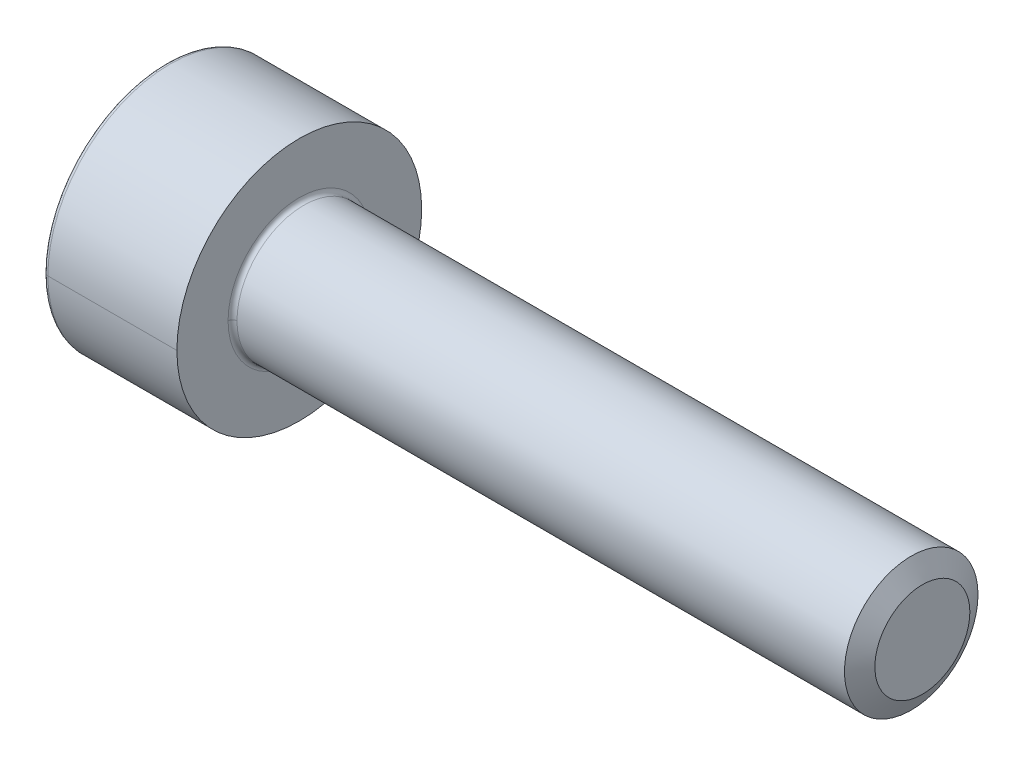
ISO-10303-21;
HEADER;
FILE_DESCRIPTION(('STEP AP214'),'2;1');
FILE_NAME('part.step','',(''),(''),'','','');
FILE_SCHEMA(('AUTOMOTIVE_DESIGN { 1 0 10303 214 1 1 1 1 }'));
ENDSEC;
DATA;
#1=APPLICATION_CONTEXT('core data for automotive mechanical design processes');
#2=APPLICATION_PROTOCOL_DEFINITION('international standard','automotive_design',2000,#1);
#3=PRODUCT_CONTEXT('',#1,'mechanical');
#4=PRODUCT('Part','Part','',(#3));
#5=PRODUCT_RELATED_PRODUCT_CATEGORY('part','',(#4));
#6=PRODUCT_DEFINITION_FORMATION('','',#4);
#7=PRODUCT_DEFINITION_CONTEXT('part definition',#1,'design');
#8=PRODUCT_DEFINITION('design','',#6,#7);
#9=PRODUCT_DEFINITION_SHAPE('','',#8);
#10=(LENGTH_UNIT() NAMED_UNIT(*) SI_UNIT(.MILLI.,.METRE.));
#11=(NAMED_UNIT(*) PLANE_ANGLE_UNIT() SI_UNIT($,.RADIAN.));
#12=(NAMED_UNIT(*) SI_UNIT($,.STERADIAN.) SOLID_ANGLE_UNIT());
#13=UNCERTAINTY_MEASURE_WITH_UNIT(LENGTH_MEASURE(1.E-05),#10,'distance_accuracy_value','');
#14=(GEOMETRIC_REPRESENTATION_CONTEXT(3) GLOBAL_UNCERTAINTY_ASSIGNED_CONTEXT((#13)) GLOBAL_UNIT_ASSIGNED_CONTEXT((#10,
#11,#12)) REPRESENTATION_CONTEXT('',''));
#15=CARTESIAN_POINT('',(0.,0.,0.));
#16=DIRECTION('',(0.,0.,1.));
#17=DIRECTION('',(1.,0.,0.));
#18=AXIS2_PLACEMENT_3D('',#15,#16,#17);
#19=CARTESIAN_POINT('',(0.1,0.,0.));
#20=DIRECTION('',(-1.,0.,0.));
#21=DIRECTION('',(0.,0.,-1.));
#22=AXIS2_PLACEMENT_3D('',#19,#20,#21);
#23=TOROIDAL_SURFACE('',#22,2.65,0.1);
#24=CARTESIAN_POINT('',(0.1,0.,2.65));
#25=DIRECTION('',(0.,-1.,0.));
#26=DIRECTION('',(0.,0.,-1.));
#27=AXIS2_PLACEMENT_3D('',#24,#25,#26);
#28=CIRCLE('',#27,0.1);
#29=CARTESIAN_POINT('',(0.1,0.,2.75));
#30=VERTEX_POINT('',#29);
#31=CARTESIAN_POINT('',(0.,0.,2.65));
#32=VERTEX_POINT('',#31);
#33=EDGE_CURVE('E217',#30,#32,#28,.T.);
#34=ORIENTED_EDGE('',*,*,#33,.T.);
#35=CARTESIAN_POINT('',(0.,0.,0.));
#36=DIRECTION('',(1.,0.,0.));
#37=DIRECTION('',(0.,0.,-1.));
#38=AXIS2_PLACEMENT_3D('',#35,#36,#37);
#39=CIRCLE('',#38,2.65);
#40=CARTESIAN_POINT('',(0.,0.,-2.65));
#41=VERTEX_POINT('',#40);
#42=EDGE_CURVE('E212',#32,#41,#39,.T.);
#43=ORIENTED_EDGE('',*,*,#42,.T.);
#44=CARTESIAN_POINT('',(0.1,0.,-2.65));
#45=DIRECTION('',(0.,1.,0.));
#46=DIRECTION('',(0.,0.,1.));
#47=AXIS2_PLACEMENT_3D('',#44,#45,#46);
#48=CIRCLE('',#47,0.1);
#49=CARTESIAN_POINT('',(0.1,0.,-2.75));
#50=VERTEX_POINT('',#49);
#51=EDGE_CURVE('E192',#50,#41,#48,.T.);
#52=ORIENTED_EDGE('',*,*,#51,.F.);
#53=CARTESIAN_POINT('',(0.1,0.,0.));
#54=DIRECTION('',(-1.,0.,0.));
#55=DIRECTION('',(0.,0.,-1.));
#56=AXIS2_PLACEMENT_3D('',#53,#54,#55);
#57=CIRCLE('',#56,2.75);
#58=EDGE_CURVE('E204',#50,#30,#57,.T.);
#59=ORIENTED_EDGE('',*,*,#58,.T.);
#60=EDGE_LOOP('',(#34,#43,#52,#59));
#61=FACE_BOUND('',#60,.T.);
#62=ADVANCED_FACE('F38',(#61),#23,.T.);
#63=CARTESIAN_POINT('',(1.3,-0.7175,-1.24274645443067));
#64=DIRECTION('',(-1.,0.,0.));
#65=DIRECTION('',(0.,0.,-1.));
#66=AXIS2_PLACEMENT_3D('',#63,#64,#65);
#67=PLANE('',#66);
#68=DIRECTION('',(0.,0.5,-0.866025403784439));
#69=VECTOR('',#68,1.);
#70=CARTESIAN_POINT('',(1.3,-1.435,0.));
#71=LINE('',#70,#69);
#72=CARTESIAN_POINT('',(1.3,-1.435,0.));
#73=VERTEX_POINT('',#72);
#74=CARTESIAN_POINT('',(1.3,-0.7175,-1.24274645443067));
#75=VERTEX_POINT('',#74);
#76=EDGE_CURVE('E149',#73,#75,#71,.T.);
#77=ORIENTED_EDGE('',*,*,#76,.F.);
#78=DIRECTION('',(0.,-0.5,-0.866025403784439));
#79=VECTOR('',#78,1.);
#80=CARTESIAN_POINT('',(1.3,-0.7175,1.24274645443067));
#81=LINE('',#80,#79);
#82=CARTESIAN_POINT('',(1.3,-0.7175,1.24274645443067));
#83=VERTEX_POINT('',#82);
#84=EDGE_CURVE('E168',#83,#73,#81,.T.);
#85=ORIENTED_EDGE('',*,*,#84,.F.);
#86=DIRECTION('',(0.,-1.,0.));
#87=VECTOR('',#86,1.);
#88=CARTESIAN_POINT('',(1.3,0.7175,1.24274645443067));
#89=LINE('',#88,#87);
#90=CARTESIAN_POINT('',(1.3,0.7175,1.24274645443067));
#91=VERTEX_POINT('',#90);
#92=EDGE_CURVE('E174',#91,#83,#89,.T.);
#93=ORIENTED_EDGE('',*,*,#92,.F.);
#94=DIRECTION('',(0.,-0.5,0.866025403784439));
#95=VECTOR('',#94,1.);
#96=CARTESIAN_POINT('',(1.3,1.435,0.));
#97=LINE('',#96,#95);
#98=CARTESIAN_POINT('',(1.3,1.435,0.));
#99=VERTEX_POINT('',#98);
#100=EDGE_CURVE('E263',#99,#91,#97,.T.);
#101=ORIENTED_EDGE('',*,*,#100,.F.);
#102=DIRECTION('',(0.,0.5,0.866025403784439));
#103=VECTOR('',#102,1.);
#104=CARTESIAN_POINT('',(1.3,0.7175,-1.24274645443067));
#105=LINE('',#104,#103);
#106=CARTESIAN_POINT('',(1.3,0.7175,-1.24274645443067));
#107=VERTEX_POINT('',#106);
#108=EDGE_CURVE('E157',#107,#99,#105,.T.);
#109=ORIENTED_EDGE('',*,*,#108,.F.);
#110=DIRECTION('',(0.,1.,0.));
#111=VECTOR('',#110,1.);
#112=CARTESIAN_POINT('',(1.3,-0.7175,-1.24274645443067));
#113=LINE('',#112,#111);
#114=EDGE_CURVE('E11',#75,#107,#113,.T.);
#115=ORIENTED_EDGE('',*,*,#114,.F.);
#116=EDGE_LOOP('',(#77,#85,#93,#101,#109,#115));
#117=FACE_BOUND('',#116,.T.);
#118=ADVANCED_FACE('F154',(#117),#67,.T.);
#119=CARTESIAN_POINT('',(1.3,-0.7175,-1.24274645443067));
#120=DIRECTION('',(0.,0.,-1.));
#121=DIRECTION('',(0.,-1.,0.));
#122=AXIS2_PLACEMENT_3D('',#119,#120,#121);
#123=PLANE('',#122);
#124=DIRECTION('',(0.,1.,0.));
#125=VECTOR('',#124,1.);
#126=CARTESIAN_POINT('',(0.,-0.7175,-1.24274645443067));
#127=LINE('',#126,#125);
#128=CARTESIAN_POINT('',(0.,-0.7175,-1.24274645443067));
#129=VERTEX_POINT('',#128);
#130=CARTESIAN_POINT('',(0.,0.7175,-1.24274645443067));
#131=VERTEX_POINT('',#130);
#132=EDGE_CURVE('E144',#129,#131,#127,.T.);
#133=ORIENTED_EDGE('',*,*,#132,.F.);
#134=DIRECTION('',(-1.,0.,0.));
#135=VECTOR('',#134,1.);
#136=CARTESIAN_POINT('',(1.3,-0.7175,-1.24274645443067));
#137=LINE('',#136,#135);
#138=EDGE_CURVE('E140',#75,#129,#137,.T.);
#139=ORIENTED_EDGE('',*,*,#138,.F.);
#140=ORIENTED_EDGE('',*,*,#114,.T.);
#141=DIRECTION('',(-1.,0.,0.));
#142=VECTOR('',#141,1.);
#143=CARTESIAN_POINT('',(1.3,0.7175,-1.24274645443067));
#144=LINE('',#143,#142);
#145=EDGE_CURVE('E49',#107,#131,#144,.T.);
#146=ORIENTED_EDGE('',*,*,#145,.T.);
#147=EDGE_LOOP('',(#133,#139,#140,#146));
#148=FACE_BOUND('',#147,.T.);
#149=ADVANCED_FACE('F40',(#148),#123,.F.);
#150=CARTESIAN_POINT('',(1.3,0.7175,-1.24274645443067));
#151=DIRECTION('',(0.,0.866025403784439,-0.5));
#152=DIRECTION('',(1.,0.,0.));
#153=AXIS2_PLACEMENT_3D('',#150,#151,#152);
#154=PLANE('',#153);
#155=DIRECTION('',(0.,0.5,0.866025403784439));
#156=VECTOR('',#155,1.);
#157=CARTESIAN_POINT('',(0.,0.7175,-1.24274645443067));
#158=LINE('',#157,#156);
#159=CARTESIAN_POINT('',(0.,1.435,0.));
#160=VERTEX_POINT('',#159);
#161=EDGE_CURVE('E133',#131,#160,#158,.T.);
#162=ORIENTED_EDGE('',*,*,#161,.F.);
#163=ORIENTED_EDGE('',*,*,#145,.F.);
#164=ORIENTED_EDGE('',*,*,#108,.T.);
#165=DIRECTION('',(-1.,0.,0.));
#166=VECTOR('',#165,1.);
#167=CARTESIAN_POINT('',(1.3,1.435,0.));
#168=LINE('',#167,#166);
#169=EDGE_CURVE('E181',#99,#160,#168,.T.);
#170=ORIENTED_EDGE('',*,*,#169,.T.);
#171=EDGE_LOOP('',(#162,#163,#164,#170));
#172=FACE_BOUND('',#171,.T.);
#173=ADVANCED_FACE('F446',(#172),#154,.F.);
#174=CARTESIAN_POINT('',(1.3,1.435,0.));
#175=DIRECTION('',(0.,0.866025403784439,0.5));
#176=DIRECTION('',(-1.,0.,0.));
#177=AXIS2_PLACEMENT_3D('',#174,#175,#176);
#178=PLANE('',#177);
#179=DIRECTION('',(0.,-0.5,0.866025403784439));
#180=VECTOR('',#179,1.);
#181=CARTESIAN_POINT('',(0.,1.435,0.));
#182=LINE('',#181,#180);
#183=CARTESIAN_POINT('',(0.,0.7175,1.24274645443067));
#184=VERTEX_POINT('',#183);
#185=EDGE_CURVE('E172',#160,#184,#182,.T.);
#186=ORIENTED_EDGE('',*,*,#185,.F.);
#187=ORIENTED_EDGE('',*,*,#169,.F.);
#188=ORIENTED_EDGE('',*,*,#100,.T.);
#189=DIRECTION('',(-1.,0.,0.));
#190=VECTOR('',#189,1.);
#191=CARTESIAN_POINT('',(1.3,0.7175,1.24274645443067));
#192=LINE('',#191,#190);
#193=EDGE_CURVE('E177',#91,#184,#192,.T.);
#194=ORIENTED_EDGE('',*,*,#193,.T.);
#195=EDGE_LOOP('',(#186,#187,#188,#194));
#196=FACE_BOUND('',#195,.T.);
#197=ADVANCED_FACE('F435',(#196),#178,.F.);
#198=CARTESIAN_POINT('',(1.3,0.7175,1.24274645443067));
#199=DIRECTION('',(0.,0.,1.));
#200=DIRECTION('',(0.,-1.,0.));
#201=AXIS2_PLACEMENT_3D('',#198,#199,#200);
#202=PLANE('',#201);
#203=DIRECTION('',(0.,-1.,0.));
#204=VECTOR('',#203,1.);
#205=CARTESIAN_POINT('',(0.,0.7175,1.24274645443067));
#206=LINE('',#205,#204);
#207=CARTESIAN_POINT('',(0.,-0.7175,1.24274645443067));
#208=VERTEX_POINT('',#207);
#209=EDGE_CURVE('E259',#184,#208,#206,.T.);
#210=ORIENTED_EDGE('',*,*,#209,.F.);
#211=ORIENTED_EDGE('',*,*,#193,.F.);
#212=ORIENTED_EDGE('',*,*,#92,.T.);
#213=DIRECTION('',(-1.,0.,0.));
#214=VECTOR('',#213,1.);
#215=CARTESIAN_POINT('',(1.3,-0.7175,1.24274645443067));
#216=LINE('',#215,#214);
#217=EDGE_CURVE('E178',#83,#208,#216,.T.);
#218=ORIENTED_EDGE('',*,*,#217,.T.);
#219=EDGE_LOOP('',(#210,#211,#212,#218));
#220=FACE_BOUND('',#219,.T.);
#221=ADVANCED_FACE('F424',(#220),#202,.F.);
#222=CARTESIAN_POINT('',(1.3,-0.7175,1.24274645443067));
#223=DIRECTION('',(0.,-0.866025403784439,0.5));
#224=DIRECTION('',(0.,0.5,0.866025403784439));
#225=AXIS2_PLACEMENT_3D('',#222,#223,#224);
#226=PLANE('',#225);
#227=DIRECTION('',(0.,-0.5,-0.866025403784439));
#228=VECTOR('',#227,1.);
#229=CARTESIAN_POINT('',(0.,-0.7175,1.24274645443067));
#230=LINE('',#229,#228);
#231=CARTESIAN_POINT('',(0.,-1.435,0.));
#232=VERTEX_POINT('',#231);
#233=EDGE_CURVE('E42',#208,#232,#230,.T.);
#234=ORIENTED_EDGE('',*,*,#233,.F.);
#235=ORIENTED_EDGE('',*,*,#217,.F.);
#236=ORIENTED_EDGE('',*,*,#84,.T.);
#237=DIRECTION('',(-1.,0.,0.));
#238=VECTOR('',#237,1.);
#239=CARTESIAN_POINT('',(1.3,-1.435,0.));
#240=LINE('',#239,#238);
#241=EDGE_CURVE('E160',#73,#232,#240,.T.);
#242=ORIENTED_EDGE('',*,*,#241,.T.);
#243=EDGE_LOOP('',(#234,#235,#236,#242));
#244=FACE_BOUND('',#243,.T.);
#245=ADVANCED_FACE('F414',(#244),#226,.F.);
#246=CARTESIAN_POINT('',(1.3,-1.435,0.));
#247=DIRECTION('',(0.,-0.866025403784439,-0.5));
#248=DIRECTION('',(-1.,0.,0.));
#249=AXIS2_PLACEMENT_3D('',#246,#247,#248);
#250=PLANE('',#249);
#251=DIRECTION('',(0.,0.5,-0.866025403784439));
#252=VECTOR('',#251,1.);
#253=CARTESIAN_POINT('',(0.,-1.435,0.));
#254=LINE('',#253,#252);
#255=EDGE_CURVE('E208',#232,#129,#254,.T.);
#256=ORIENTED_EDGE('',*,*,#255,.F.);
#257=ORIENTED_EDGE('',*,*,#241,.F.);
#258=ORIENTED_EDGE('',*,*,#76,.T.);
#259=ORIENTED_EDGE('',*,*,#138,.T.);
#260=EDGE_LOOP('',(#256,#257,#258,#259));
#261=FACE_BOUND('',#260,.T.);
#262=ADVANCED_FACE('F158',(#261),#250,.F.);
#263=CARTESIAN_POINT('',(3.1,0.,0.));
#264=DIRECTION('',(1.,0.,0.));
#265=DIRECTION('',(0.,0.,1.));
#266=AXIS2_PLACEMENT_3D('',#263,#264,#265);
#267=TOROIDAL_SURFACE('',#266,1.6,0.1);
#268=CARTESIAN_POINT('',(3.1,0.,-1.6));
#269=DIRECTION('',(0.,-1.,0.));
#270=DIRECTION('',(0.,0.,-1.));
#271=AXIS2_PLACEMENT_3D('',#268,#269,#270);
#272=CIRCLE('',#271,0.1);
#273=CARTESIAN_POINT('',(3.1,0.,-1.5));
#274=VERTEX_POINT('',#273);
#275=CARTESIAN_POINT('',(3.,0.,-1.6));
#276=VERTEX_POINT('',#275);
#277=EDGE_CURVE('E203',#274,#276,#272,.T.);
#278=ORIENTED_EDGE('',*,*,#277,.T.);
#279=CARTESIAN_POINT('',(3.,0.,0.));
#280=DIRECTION('',(-1.,0.,0.));
#281=DIRECTION('',(0.,0.,1.));
#282=AXIS2_PLACEMENT_3D('',#279,#280,#281);
#283=CIRCLE('',#282,1.6);
#284=CARTESIAN_POINT('',(3.,0.,1.6));
#285=VERTEX_POINT('',#284);
#286=EDGE_CURVE('E150',#285,#276,#283,.T.);
#287=ORIENTED_EDGE('',*,*,#286,.F.);
#288=CARTESIAN_POINT('',(3.1,0.,1.6));
#289=DIRECTION('',(0.,1.,0.));
#290=DIRECTION('',(0.,0.,1.));
#291=AXIS2_PLACEMENT_3D('',#288,#289,#290);
#292=CIRCLE('',#291,0.1);
#293=CARTESIAN_POINT('',(3.1,0.,1.5));
#294=VERTEX_POINT('',#293);
#295=EDGE_CURVE('E229',#294,#285,#292,.T.);
#296=ORIENTED_EDGE('',*,*,#295,.F.);
#297=CARTESIAN_POINT('',(3.1,0.,0.));
#298=DIRECTION('',(-1.,0.,0.));
#299=DIRECTION('',(0.,0.,1.));
#300=AXIS2_PLACEMENT_3D('',#297,#298,#299);
#301=CIRCLE('',#300,1.5);
#302=EDGE_CURVE('E186',#294,#274,#301,.T.);
#303=ORIENTED_EDGE('',*,*,#302,.T.);
#304=EDGE_LOOP('',(#278,#287,#296,#303));
#305=FACE_BOUND('',#304,.T.);
#306=ADVANCED_FACE('F293',(#305),#267,.F.);
#307=CARTESIAN_POINT('',(3.,2.75,0.));
#308=DIRECTION('',(1.,0.,0.));
#309=DIRECTION('',(0.,1.,0.));
#310=AXIS2_PLACEMENT_3D('',#307,#308,#309);
#311=PLANE('',#310);
#312=ORIENTED_EDGE('',*,*,#286,.T.);
#313=CARTESIAN_POINT('',(3.,0.,0.));
#314=DIRECTION('',(-1.,0.,0.));
#315=DIRECTION('',(0.,0.,1.));
#316=AXIS2_PLACEMENT_3D('',#313,#314,#315);
#317=CIRCLE('',#316,1.6);
#318=EDGE_CURVE('E225',#276,#285,#317,.T.);
#319=ORIENTED_EDGE('',*,*,#318,.T.);
#320=EDGE_LOOP('',(#312,#319));
#321=FACE_BOUND('',#320,.T.);
#322=CARTESIAN_POINT('',(3.,0.,0.));
#323=DIRECTION('',(-1.,0.,0.));
#324=DIRECTION('',(0.,0.,1.));
#325=AXIS2_PLACEMENT_3D('',#322,#323,#324);
#326=CIRCLE('',#325,2.75);
#327=CARTESIAN_POINT('',(3.,0.,2.75));
#328=VERTEX_POINT('',#327);
#329=CARTESIAN_POINT('',(3.,0.,-2.75));
#330=VERTEX_POINT('',#329);
#331=EDGE_CURVE('E199',#328,#330,#326,.T.);
#332=ORIENTED_EDGE('',*,*,#331,.F.);
#333=CARTESIAN_POINT('',(3.,0.,0.));
#334=DIRECTION('',(-1.,0.,0.));
#335=DIRECTION('',(0.,0.,1.));
#336=AXIS2_PLACEMENT_3D('',#333,#334,#335);
#337=CIRCLE('',#336,2.75);
#338=EDGE_CURVE('E185',#330,#328,#337,.T.);
#339=ORIENTED_EDGE('',*,*,#338,.F.);
#340=EDGE_LOOP('',(#332,#339));
#341=FACE_BOUND('',#340,.T.);
#342=ADVANCED_FACE('F294',(#321,#341),#311,.T.);
#343=CARTESIAN_POINT('',(0.,0.,0.));
#344=DIRECTION('',(1.,0.,0.));
#345=DIRECTION('',(0.,0.,1.));
#346=AXIS2_PLACEMENT_3D('',#343,#344,#345);
#347=CYLINDRICAL_SURFACE('',#346,2.75);
#348=DIRECTION('',(1.,0.,0.));
#349=VECTOR('',#348,1.);
#350=CARTESIAN_POINT('',(0.,0.,-2.75));
#351=LINE('',#350,#349);
#352=EDGE_CURVE('E226',#50,#330,#351,.T.);
#353=ORIENTED_EDGE('',*,*,#352,.T.);
#354=ORIENTED_EDGE('',*,*,#338,.T.);
#355=DIRECTION('',(1.,0.,0.));
#356=VECTOR('',#355,1.);
#357=CARTESIAN_POINT('',(0.,0.,2.75));
#358=LINE('',#357,#356);
#359=EDGE_CURVE('E191',#30,#328,#358,.T.);
#360=ORIENTED_EDGE('',*,*,#359,.F.);
#361=ORIENTED_EDGE('',*,*,#58,.F.);
#362=EDGE_LOOP('',(#353,#354,#360,#361));
#363=FACE_BOUND('',#362,.T.);
#364=ADVANCED_FACE('F297',(#363),#347,.T.);
#365=CARTESIAN_POINT('',(0.,0.,0.));
#366=DIRECTION('',(-1.,0.,0.));
#367=DIRECTION('',(0.,0.,-1.));
#368=AXIS2_PLACEMENT_3D('',#365,#366,#367);
#369=PLANE('',#368);
#370=ORIENTED_EDGE('',*,*,#255,.T.);
#371=ORIENTED_EDGE('',*,*,#132,.T.);
#372=ORIENTED_EDGE('',*,*,#161,.T.);
#373=ORIENTED_EDGE('',*,*,#185,.T.);
#374=ORIENTED_EDGE('',*,*,#209,.T.);
#375=ORIENTED_EDGE('',*,*,#233,.T.);
#376=EDGE_LOOP('',(#370,#371,#372,#373,#374,#375));
#377=FACE_BOUND('',#376,.T.);
#378=CARTESIAN_POINT('',(0.,0.,0.));
#379=DIRECTION('',(1.,0.,0.));
#380=DIRECTION('',(0.,0.,-1.));
#381=AXIS2_PLACEMENT_3D('',#378,#379,#380);
#382=CIRCLE('',#381,2.65);
#383=EDGE_CURVE('E197',#41,#32,#382,.T.);
#384=ORIENTED_EDGE('',*,*,#383,.F.);
#385=ORIENTED_EDGE('',*,*,#42,.F.);
#386=EDGE_LOOP('',(#384,#385));
#387=FACE_BOUND('',#386,.T.);
#388=ADVANCED_FACE('F316',(#377,#387),#369,.T.);
#389=CARTESIAN_POINT('',(0.,0.,0.));
#390=DIRECTION('',(1.,0.,0.));
#391=DIRECTION('',(0.,0.,1.));
#392=AXIS2_PLACEMENT_3D('',#389,#390,#391);
#393=CYLINDRICAL_SURFACE('',#392,1.5);
#394=ORIENTED_EDGE('',*,*,#302,.F.);
#395=DIRECTION('',(1.,0.,0.));
#396=VECTOR('',#395,1.);
#397=CARTESIAN_POINT('',(0.,0.,1.5));
#398=LINE('',#397,#396);
#399=CARTESIAN_POINT('',(14.75,0.,1.5));
#400=VERTEX_POINT('',#399);
#401=EDGE_CURVE('E253',#294,#400,#398,.T.);
#402=ORIENTED_EDGE('',*,*,#401,.T.);
#403=ORIENTED_EDGE('',*,*,#401,.F.);
#404=CARTESIAN_POINT('',(3.1,0.,0.));
#405=DIRECTION('',(-1.,0.,0.));
#406=DIRECTION('',(0.,0.,1.));
#407=AXIS2_PLACEMENT_3D('',#404,#405,#406);
#408=CIRCLE('',#407,1.5);
#409=EDGE_CURVE('E196',#274,#294,#408,.T.);
#410=ORIENTED_EDGE('',*,*,#409,.F.);
#411=DIRECTION('',(1.,0.,0.));
#412=VECTOR('',#411,1.);
#413=CARTESIAN_POINT('',(0.,0.,-1.5));
#414=LINE('',#413,#412);
#415=CARTESIAN_POINT('',(14.75,0.,-1.5));
#416=VERTEX_POINT('',#415);
#417=EDGE_CURVE('E190',#274,#416,#414,.T.);
#418=ORIENTED_EDGE('',*,*,#417,.T.);
#419=ORIENTED_EDGE('',*,*,#417,.F.);
#420=EDGE_LOOP('',(#394,#402,#403,#410,#418,#419));
#421=FACE_BOUND('',#420,.T.);
#422=CARTESIAN_POINT('',(16.75,0.,0.));
#423=DIRECTION('',(1.,0.,0.));
#424=DIRECTION('',(0.,0.,-1.));
#425=AXIS2_PLACEMENT_3D('',#422,#423,#424);
#426=CIRCLE('',#425,1.5);
#427=CARTESIAN_POINT('',(16.75,0.,-1.5));
#428=VERTEX_POINT('',#427);
#429=EDGE_CURVE('E345',#428,#428,#426,.T.);
#430=ORIENTED_EDGE('',*,*,#429,.F.);
#431=EDGE_LOOP('',(#430));
#432=FACE_BOUND('',#431,.T.);
#433=ADVANCED_FACE('F289',(#421,#432),#393,.T.);
#434=CARTESIAN_POINT('',(0.,0.,0.));
#435=DIRECTION('',(1.,0.,0.));
#436=DIRECTION('',(0.,0.,1.));
#437=AXIS2_PLACEMENT_3D('',#434,#435,#436);
#438=CYLINDRICAL_SURFACE('',#437,2.75);
#439=CARTESIAN_POINT('',(0.1,0.,0.));
#440=DIRECTION('',(-1.,0.,0.));
#441=DIRECTION('',(0.,0.,-1.));
#442=AXIS2_PLACEMENT_3D('',#439,#440,#441);
#443=CIRCLE('',#442,2.75);
#444=EDGE_CURVE('E221',#30,#50,#443,.T.);
#445=ORIENTED_EDGE('',*,*,#444,.F.);
#446=ORIENTED_EDGE('',*,*,#359,.T.);
#447=ORIENTED_EDGE('',*,*,#331,.T.);
#448=ORIENTED_EDGE('',*,*,#352,.F.);
#449=EDGE_LOOP('',(#445,#446,#447,#448));
#450=FACE_BOUND('',#449,.T.);
#451=ADVANCED_FACE('F303',(#450),#438,.T.);
#452=CARTESIAN_POINT('',(3.1,0.,0.));
#453=DIRECTION('',(1.,0.,0.));
#454=DIRECTION('',(0.,0.,1.));
#455=AXIS2_PLACEMENT_3D('',#452,#453,#454);
#456=TOROIDAL_SURFACE('',#455,1.6,0.1);
#457=ORIENTED_EDGE('',*,*,#409,.T.);
#458=ORIENTED_EDGE('',*,*,#295,.T.);
#459=ORIENTED_EDGE('',*,*,#318,.F.);
#460=ORIENTED_EDGE('',*,*,#277,.F.);
#461=EDGE_LOOP('',(#457,#458,#459,#460));
#462=FACE_BOUND('',#461,.T.);
#463=ADVANCED_FACE('F359',(#462),#456,.F.);
#464=CARTESIAN_POINT('',(0.1,0.,0.));
#465=DIRECTION('',(-1.,0.,0.));
#466=DIRECTION('',(0.,0.,-1.));
#467=AXIS2_PLACEMENT_3D('',#464,#465,#466);
#468=TOROIDAL_SURFACE('',#467,2.65,0.1);
#469=ORIENTED_EDGE('',*,*,#444,.T.);
#470=ORIENTED_EDGE('',*,*,#51,.T.);
#471=ORIENTED_EDGE('',*,*,#383,.T.);
#472=ORIENTED_EDGE('',*,*,#33,.F.);
#473=EDGE_LOOP('',(#469,#470,#471,#472));
#474=FACE_BOUND('',#473,.T.);
#475=ADVANCED_FACE('F314',(#474),#468,.T.);
#476=CARTESIAN_POINT('',(17.,0.,0.));
#477=DIRECTION('',(-1.,0.,0.));
#478=DIRECTION('',(0.,0.,-1.));
#479=AXIS2_PLACEMENT_3D('',#476,#477,#478);
#480=PLANE('',#479);
#481=CARTESIAN_POINT('',(17.,0.,0.));
#482=DIRECTION('',(1.,0.,0.));
#483=DIRECTION('',(0.,0.,-1.));
#484=AXIS2_PLACEMENT_3D('',#481,#482,#483);
#485=CIRCLE('',#484,1.067);
#486=CARTESIAN_POINT('',(17.,0.,-1.067));
#487=VERTEX_POINT('',#486);
#488=EDGE_CURVE('E270',#487,#487,#485,.T.);
#489=ORIENTED_EDGE('',*,*,#488,.T.);
#490=EDGE_LOOP('',(#489));
#491=FACE_BOUND('',#490,.T.);
#492=ADVANCED_FACE('F333',(#491),#480,.F.);
#493=CARTESIAN_POINT('',(17.,0.,0.));
#494=DIRECTION('',(-1.,0.,0.));
#495=DIRECTION('',(0.,0.,-1.));
#496=AXIS2_PLACEMENT_3D('',#493,#494,#495);
#497=CONICAL_SURFACE('',#496,1.067,1.04718484902493);
#498=ORIENTED_EDGE('',*,*,#429,.T.);
#499=EDGE_LOOP('',(#498));
#500=FACE_BOUND('',#499,.T.);
#501=ORIENTED_EDGE('',*,*,#488,.F.);
#502=EDGE_LOOP('',(#501));
#503=FACE_BOUND('',#502,.T.);
#504=ADVANCED_FACE('F336',(#500,#503),#497,.T.);
#505=CLOSED_SHELL('',(#62,#118,#149,#173,#197,#221,#245,#262,#306,#342,#364,#388,#433,#451,#463,
#475,#492,#504));
#506=MANIFOLD_SOLID_BREP('B2',#505);
#507=ADVANCED_BREP_SHAPE_REPRESENTATION('',(#18,#506),#14);
#508=SHAPE_DEFINITION_REPRESENTATION(#9,#507);
ENDSEC;
END-ISO-10303-21;
